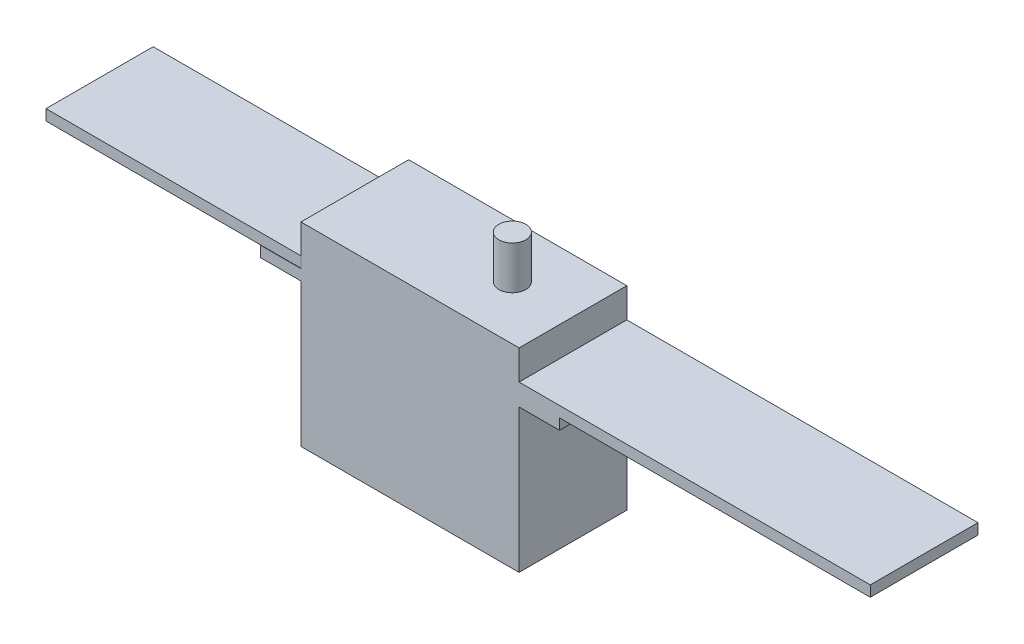
ISO-10303-21;
HEADER;
FILE_DESCRIPTION(('STEP AP214'),'2;1');
FILE_NAME('part.step','',(''),(''),'','','');
FILE_SCHEMA(('AUTOMOTIVE_DESIGN { 1 0 10303 214 1 1 1 1 }'));
ENDSEC;
DATA;
#1=APPLICATION_CONTEXT('core data for automotive mechanical design processes');
#2=APPLICATION_PROTOCOL_DEFINITION('international standard','automotive_design',2000,#1);
#3=PRODUCT_CONTEXT('',#1,'mechanical');
#4=PRODUCT('Part','Part','',(#3));
#5=PRODUCT_RELATED_PRODUCT_CATEGORY('part','',(#4));
#6=PRODUCT_DEFINITION_FORMATION('','',#4);
#7=PRODUCT_DEFINITION_CONTEXT('part definition',#1,'design');
#8=PRODUCT_DEFINITION('design','',#6,#7);
#9=PRODUCT_DEFINITION_SHAPE('','',#8);
#10=(LENGTH_UNIT() NAMED_UNIT(*) SI_UNIT(.MILLI.,.METRE.));
#11=(NAMED_UNIT(*) PLANE_ANGLE_UNIT() SI_UNIT($,.RADIAN.));
#12=(NAMED_UNIT(*) SI_UNIT($,.STERADIAN.) SOLID_ANGLE_UNIT());
#13=UNCERTAINTY_MEASURE_WITH_UNIT(LENGTH_MEASURE(1.E-05),#10,'distance_accuracy_value','');
#14=(GEOMETRIC_REPRESENTATION_CONTEXT(3) GLOBAL_UNCERTAINTY_ASSIGNED_CONTEXT((#13)) GLOBAL_UNIT_ASSIGNED_CONTEXT((#10,
#11,#12)) REPRESENTATION_CONTEXT('',''));
#15=CARTESIAN_POINT('',(0.,0.,0.));
#16=DIRECTION('',(0.,0.,1.));
#17=DIRECTION('',(1.,0.,0.));
#18=AXIS2_PLACEMENT_3D('',#15,#16,#17);
#19=CARTESIAN_POINT('',(23.7567379919232,36.1,-10.7539016762014));
#20=DIRECTION('',(-1.,0.,0.));
#21=DIRECTION('',(0.,0.,1.));
#22=AXIS2_PLACEMENT_3D('',#19,#20,#21);
#23=PLANE('',#22);
#24=DIRECTION('',(0.,-1.,0.));
#25=VECTOR('',#24,1.);
#26=CARTESIAN_POINT('',(23.7567379919232,30.6,-10.7535493471715));
#27=LINE('',#26,#25);
#28=CARTESIAN_POINT('',(23.7567379919232,30.6,-10.7535493471715));
#29=VERTEX_POINT('',#28);
#30=CARTESIAN_POINT('',(23.7567379919232,28.6,-10.7535493471715));
#31=VERTEX_POINT('',#30);
#32=EDGE_CURVE('E717',#29,#31,#27,.T.);
#33=ORIENTED_EDGE('',*,*,#32,.T.);
#34=DIRECTION('',(0.,0.,-1.));
#35=VECTOR('',#34,1.);
#36=CARTESIAN_POINT('',(23.7567379919232,28.6,-10.7539016762014));
#37=LINE('',#36,#35);
#38=CARTESIAN_POINT('',(23.7567379919232,28.6,-10.7539016762015));
#39=VERTEX_POINT('',#38);
#40=EDGE_CURVE('E264',#31,#39,#37,.T.);
#41=ORIENTED_EDGE('',*,*,#40,.T.);
#42=DIRECTION('',(0.,-1.,0.));
#43=VECTOR('',#42,1.);
#44=CARTESIAN_POINT('',(23.7567379919232,36.1,-10.7539016762014));
#45=LINE('',#44,#43);
#46=CARTESIAN_POINT('',(23.7567379919232,36.1,-10.7539016762014));
#47=VERTEX_POINT('',#46);
#48=EDGE_CURVE('E203',#47,#39,#45,.T.);
#49=ORIENTED_EDGE('',*,*,#48,.F.);
#50=DIRECTION('',(0.,0.,-1.));
#51=VECTOR('',#50,1.);
#52=CARTESIAN_POINT('',(23.7567379919232,36.1,-10.7539016762014));
#53=LINE('',#52,#51);
#54=CARTESIAN_POINT('',(23.7567379919232,36.1,9.24609832379855));
#55=VERTEX_POINT('',#54);
#56=EDGE_CURVE('E200',#55,#47,#53,.T.);
#57=ORIENTED_EDGE('',*,*,#56,.F.);
#58=DIRECTION('',(0.,-1.,0.));
#59=VECTOR('',#58,1.);
#60=CARTESIAN_POINT('',(23.7567379919232,36.1,9.24609832379855));
#61=LINE('',#60,#59);
#62=CARTESIAN_POINT('',(23.7567379919232,30.6,9.24609832379855));
#63=VERTEX_POINT('',#62);
#64=EDGE_CURVE('E182',#55,#63,#61,.T.);
#65=ORIENTED_EDGE('',*,*,#64,.T.);
#66=DIRECTION('',(0.,0.,1.));
#67=VECTOR('',#66,1.);
#68=CARTESIAN_POINT('',(23.7567379919232,30.6,9.24609832379855));
#69=LINE('',#68,#67);
#70=EDGE_CURVE('E189',#29,#63,#69,.T.);
#71=ORIENTED_EDGE('',*,*,#70,.F.);
#72=EDGE_LOOP('',(#33,#41,#49,#57,#65,#71));
#73=FACE_BOUND('',#72,.T.);
#74=ADVANCED_FACE('F34',(#73),#23,.F.);
#75=CARTESIAN_POINT('',(31.2567379919232,28.6,-10.7539016762015));
#76=DIRECTION('',(0.,1.,0.));
#77=DIRECTION('',(0.,0.,1.));
#78=AXIS2_PLACEMENT_3D('',#75,#76,#77);
#79=PLANE('',#78);
#80=ORIENTED_EDGE('',*,*,#40,.F.);
#81=DIRECTION('',(-1.,0.,0.));
#82=VECTOR('',#81,1.);
#83=CARTESIAN_POINT('',(23.7567379919232,28.6,-10.7535493471715));
#84=LINE('',#83,#82);
#85=CARTESIAN_POINT('',(31.2567379919232,28.6,-10.7535493471715));
#86=VERTEX_POINT('',#85);
#87=EDGE_CURVE('E720',#86,#31,#84,.T.);
#88=ORIENTED_EDGE('',*,*,#87,.F.);
#89=DIRECTION('',(0.,0.,-1.));
#90=VECTOR('',#89,1.);
#91=CARTESIAN_POINT('',(31.2567379919232,28.6,-10.7539016762015));
#92=LINE('',#91,#90);
#93=CARTESIAN_POINT('',(31.2567379919232,28.6,-10.7539016762015));
#94=VERTEX_POINT('',#93);
#95=EDGE_CURVE('E242',#86,#94,#92,.T.);
#96=ORIENTED_EDGE('',*,*,#95,.T.);
#97=DIRECTION('',(-1.,0.,0.));
#98=VECTOR('',#97,1.);
#99=CARTESIAN_POINT('',(31.2567379919232,28.6,-10.7539016762015));
#100=LINE('',#99,#98);
#101=EDGE_CURVE('E246',#94,#39,#100,.T.);
#102=ORIENTED_EDGE('',*,*,#101,.T.);
#103=EDGE_LOOP('',(#80,#88,#96,#102));
#104=FACE_BOUND('',#103,.T.);
#105=ADVANCED_FACE('F376',(#104),#79,.T.);
#106=CARTESIAN_POINT('',(-16.7432620080768,36.1,-10.7539016762014));
#107=DIRECTION('',(1.,0.,0.));
#108=DIRECTION('',(0.,0.,-1.));
#109=AXIS2_PLACEMENT_3D('',#106,#107,#108);
#110=PLANE('',#109);
#111=DIRECTION('',(0.,-1.,0.));
#112=VECTOR('',#111,1.);
#113=CARTESIAN_POINT('',(-16.7432620080768,30.6,-10.7106947176288));
#114=LINE('',#113,#112);
#115=CARTESIAN_POINT('',(-16.7432620080768,30.6,-10.7106947176288));
#116=VERTEX_POINT('',#115);
#117=CARTESIAN_POINT('',(-16.7432620080768,28.6,-10.7106947176288));
#118=VERTEX_POINT('',#117);
#119=EDGE_CURVE('E333',#116,#118,#114,.T.);
#120=ORIENTED_EDGE('',*,*,#119,.F.);
#121=DIRECTION('',(0.,0.,-1.));
#122=VECTOR('',#121,1.);
#123=CARTESIAN_POINT('',(-16.7432620080768,30.6,9.18935359710815));
#124=LINE('',#123,#122);
#125=CARTESIAN_POINT('',(-16.7432620080768,30.6,9.18935359710815));
#126=VERTEX_POINT('',#125);
#127=EDGE_CURVE('E336',#126,#116,#124,.T.);
#128=ORIENTED_EDGE('',*,*,#127,.F.);
#129=DIRECTION('',(0.,-1.,0.));
#130=VECTOR('',#129,1.);
#131=CARTESIAN_POINT('',(-16.7432620080768,30.6,9.18935359710815));
#132=LINE('',#131,#130);
#133=CARTESIAN_POINT('',(-16.7432620080768,28.6,9.18935359710815));
#134=VERTEX_POINT('',#133);
#135=EDGE_CURVE('E691',#126,#134,#132,.T.);
#136=ORIENTED_EDGE('',*,*,#135,.T.);
#137=DIRECTION('',(0.,0.,1.));
#138=VECTOR('',#137,1.);
#139=CARTESIAN_POINT('',(-16.7432620080768,28.6,-10.7539016762014));
#140=LINE('',#139,#138);
#141=CARTESIAN_POINT('',(-16.7432620080768,28.6,9.24609832379855));
#142=VERTEX_POINT('',#141);
#143=EDGE_CURVE('E266',#134,#142,#140,.T.);
#144=ORIENTED_EDGE('',*,*,#143,.T.);
#145=DIRECTION('',(0.,-1.,0.));
#146=VECTOR('',#145,1.);
#147=CARTESIAN_POINT('',(-16.7432620080768,36.1,9.24609832379855));
#148=LINE('',#147,#146);
#149=CARTESIAN_POINT('',(-16.7432620080768,36.1,9.24609832379855));
#150=VERTEX_POINT('',#149);
#151=EDGE_CURVE('E11',#150,#142,#148,.T.);
#152=ORIENTED_EDGE('',*,*,#151,.F.);
#153=DIRECTION('',(0.,0.,1.));
#154=VECTOR('',#153,1.);
#155=CARTESIAN_POINT('',(-16.7432620080768,36.1,-10.7539016762014));
#156=LINE('',#155,#154);
#157=CARTESIAN_POINT('',(-16.7432620080768,36.1,-10.7539016762014));
#158=VERTEX_POINT('',#157);
#159=EDGE_CURVE('E277',#158,#150,#156,.T.);
#160=ORIENTED_EDGE('',*,*,#159,.F.);
#161=DIRECTION('',(0.,-1.,0.));
#162=VECTOR('',#161,1.);
#163=CARTESIAN_POINT('',(-16.7432620080768,36.1,-10.7539016762014));
#164=LINE('',#163,#162);
#165=CARTESIAN_POINT('',(-16.7432620080768,28.6,-10.7539016762014));
#166=VERTEX_POINT('',#165);
#167=EDGE_CURVE('E296',#158,#166,#164,.T.);
#168=ORIENTED_EDGE('',*,*,#167,.T.);
#169=EDGE_CURVE('E267',#166,#118,#140,.T.);
#170=ORIENTED_EDGE('',*,*,#169,.T.);
#171=EDGE_LOOP('',(#120,#128,#136,#144,#152,#160,#168,#170));
#172=FACE_BOUND('',#171,.T.);
#173=ADVANCED_FACE('F331',(#172),#110,.F.);
#174=DIRECTION('',(0.,0.,-1.));
#175=VECTOR('',#174,1.);
#176=CARTESIAN_POINT('',(-24.2432620080768,28.6,-10.7539016762014));
#177=LINE('',#176,#175);
#178=CARTESIAN_POINT('',(-24.2432620080768,28.6,-10.7106947176288));
#179=VERTEX_POINT('',#178);
#180=CARTESIAN_POINT('',(-24.2432620080768,28.6,-10.7539016762014));
#181=VERTEX_POINT('',#180);
#182=EDGE_CURVE('E229',#179,#181,#177,.T.);
#183=ORIENTED_EDGE('',*,*,#182,.F.);
#184=DIRECTION('',(-1.,0.,0.));
#185=VECTOR('',#184,1.);
#186=CARTESIAN_POINT('',(-16.7432620080768,28.6,-10.7106947176288));
#187=LINE('',#186,#185);
#188=EDGE_CURVE('E59',#118,#179,#187,.T.);
#189=ORIENTED_EDGE('',*,*,#188,.F.);
#190=ORIENTED_EDGE('',*,*,#169,.F.);
#191=EDGE_CURVE('E250',#166,#181,#100,.T.);
#192=ORIENTED_EDGE('',*,*,#191,.T.);
#193=EDGE_LOOP('',(#183,#189,#190,#192));
#194=FACE_BOUND('',#193,.T.);
#195=ADVANCED_FACE('F329',(#194),#79,.T.);
#196=ORIENTED_EDGE('',*,*,#143,.F.);
#197=DIRECTION('',(1.,0.,0.));
#198=VECTOR('',#197,1.);
#199=CARTESIAN_POINT('',(-16.7432620080768,28.6,9.18935359710815));
#200=LINE('',#199,#198);
#201=CARTESIAN_POINT('',(-24.2432620080768,28.6,9.18935359710815));
#202=VERTEX_POINT('',#201);
#203=EDGE_CURVE('E682',#202,#134,#200,.T.);
#204=ORIENTED_EDGE('',*,*,#203,.F.);
#205=CARTESIAN_POINT('',(-24.2432620080768,28.6,9.24609832379856));
#206=VERTEX_POINT('',#205);
#207=EDGE_CURVE('E230',#206,#202,#177,.T.);
#208=ORIENTED_EDGE('',*,*,#207,.F.);
#209=DIRECTION('',(-1.,0.,0.));
#210=VECTOR('',#209,1.);
#211=CARTESIAN_POINT('',(31.2567379919232,28.6,9.24609832379855));
#212=LINE('',#211,#210);
#213=EDGE_CURVE('E251',#142,#206,#212,.T.);
#214=ORIENTED_EDGE('',*,*,#213,.F.);
#215=EDGE_LOOP('',(#196,#204,#208,#214));
#216=FACE_BOUND('',#215,.T.);
#217=ADVANCED_FACE('F382',(#216),#79,.T.);
#218=CARTESIAN_POINT('',(-16.7432620080768,26.6,9.24609832379855));
#219=VERTEX_POINT('',#218);
#220=CARTESIAN_POINT('',(-16.7432620080768,0.,9.24609832379855));
#221=VERTEX_POINT('',#220);
#222=EDGE_CURVE('E43',#219,#221,#148,.T.);
#223=ORIENTED_EDGE('',*,*,#222,.F.);
#224=DIRECTION('',(0.,0.,-1.));
#225=VECTOR('',#224,1.);
#226=CARTESIAN_POINT('',(-16.7432620080768,26.6,-10.7539016762014));
#227=LINE('',#226,#225);
#228=CARTESIAN_POINT('',(-16.7432620080768,26.6,-10.7539016762014));
#229=VERTEX_POINT('',#228);
#230=EDGE_CURVE('E261',#219,#229,#227,.T.);
#231=ORIENTED_EDGE('',*,*,#230,.T.);
#232=CARTESIAN_POINT('',(-16.7432620080768,0.,-10.7539016762014));
#233=VERTEX_POINT('',#232);
#234=EDGE_CURVE('E286',#229,#233,#164,.T.);
#235=ORIENTED_EDGE('',*,*,#234,.T.);
#236=DIRECTION('',(0.,0.,1.));
#237=VECTOR('',#236,1.);
#238=CARTESIAN_POINT('',(-16.7432620080768,0.,-10.7539016762014));
#239=LINE('',#238,#237);
#240=EDGE_CURVE('E274',#233,#221,#239,.T.);
#241=ORIENTED_EDGE('',*,*,#240,.T.);
#242=EDGE_LOOP('',(#223,#231,#235,#241));
#243=FACE_BOUND('',#242,.T.);
#244=ADVANCED_FACE('F36',(#243),#110,.F.);
#245=CARTESIAN_POINT('',(-16.7432620080768,36.1,9.24609832379855));
#246=DIRECTION('',(0.,0.,-1.));
#247=DIRECTION('',(-1.,0.,0.));
#248=AXIS2_PLACEMENT_3D('',#245,#246,#247);
#249=PLANE('',#248);
#250=CARTESIAN_POINT('',(23.7567379919232,26.6,9.24609832379855));
#251=VERTEX_POINT('',#250);
#252=CARTESIAN_POINT('',(23.7567379919232,0.,9.24609832379855));
#253=VERTEX_POINT('',#252);
#254=EDGE_CURVE('E201',#251,#253,#61,.T.);
#255=ORIENTED_EDGE('',*,*,#254,.F.);
#256=DIRECTION('',(-1.,0.,0.));
#257=VECTOR('',#256,1.);
#258=CARTESIAN_POINT('',(31.2567379919232,26.6,9.24609832379855));
#259=LINE('',#258,#257);
#260=CARTESIAN_POINT('',(31.2567379919232,26.6,9.24609832379855));
#261=VERTEX_POINT('',#260);
#262=EDGE_CURVE('E253',#261,#251,#259,.T.);
#263=ORIENTED_EDGE('',*,*,#262,.F.);
#264=DIRECTION('',(0.,1.,0.));
#265=VECTOR('',#264,1.);
#266=CARTESIAN_POINT('',(31.2567379919232,28.6,9.24609832379855));
#267=LINE('',#266,#265);
#268=CARTESIAN_POINT('',(31.2567379919232,28.6,9.24609832379855));
#269=VERTEX_POINT('',#268);
#270=EDGE_CURVE('E239',#261,#269,#267,.T.);
#271=ORIENTED_EDGE('',*,*,#270,.T.);
#272=DIRECTION('',(1.,0.,0.));
#273=VECTOR('',#272,1.);
#274=CARTESIAN_POINT('',(23.7567379919232,28.6,9.24609832379855));
#275=LINE('',#274,#273);
#276=CARTESIAN_POINT('',(88.9534286681908,28.6,9.24609832379855));
#277=VERTEX_POINT('',#276);
#278=EDGE_CURVE('E723',#269,#277,#275,.T.);
#279=ORIENTED_EDGE('',*,*,#278,.T.);
#280=DIRECTION('',(0.,-1.,0.));
#281=VECTOR('',#280,1.);
#282=CARTESIAN_POINT('',(88.9534286681908,30.6,9.24609832379855));
#283=LINE('',#282,#281);
#284=CARTESIAN_POINT('',(88.9534286681908,30.6,9.24609832379855));
#285=VERTEX_POINT('',#284);
#286=EDGE_CURVE('E185',#285,#277,#283,.T.);
#287=ORIENTED_EDGE('',*,*,#286,.F.);
#288=DIRECTION('',(1.,0.,0.));
#289=VECTOR('',#288,1.);
#290=CARTESIAN_POINT('',(23.7567379919232,30.6,9.24609832379855));
#291=LINE('',#290,#289);
#292=EDGE_CURVE('E177',#63,#285,#291,.T.);
#293=ORIENTED_EDGE('',*,*,#292,.F.);
#294=ORIENTED_EDGE('',*,*,#64,.F.);
#295=DIRECTION('',(1.,0.,0.));
#296=VECTOR('',#295,1.);
#297=CARTESIAN_POINT('',(-16.7432620080768,36.1,9.24609832379855));
#298=LINE('',#297,#296);
#299=EDGE_CURVE('E280',#150,#55,#298,.T.);
#300=ORIENTED_EDGE('',*,*,#299,.F.);
#301=ORIENTED_EDGE('',*,*,#151,.T.);
#302=ORIENTED_EDGE('',*,*,#213,.T.);
#303=DIRECTION('',(0.,1.,0.));
#304=VECTOR('',#303,1.);
#305=CARTESIAN_POINT('',(-24.2432620080768,28.6,9.24609832379856));
#306=LINE('',#305,#304);
#307=CARTESIAN_POINT('',(-24.2432620080768,26.6,9.24609832379856));
#308=VERTEX_POINT('',#307);
#309=EDGE_CURVE('E226',#308,#206,#306,.T.);
#310=ORIENTED_EDGE('',*,*,#309,.F.);
#311=EDGE_CURVE('E255',#219,#308,#259,.T.);
#312=ORIENTED_EDGE('',*,*,#311,.F.);
#313=ORIENTED_EDGE('',*,*,#222,.T.);
#314=DIRECTION('',(1.,0.,0.));
#315=VECTOR('',#314,1.);
#316=CARTESIAN_POINT('',(-16.7432620080768,0.,9.24609832379855));
#317=LINE('',#316,#315);
#318=EDGE_CURVE('E289',#221,#253,#317,.T.);
#319=ORIENTED_EDGE('',*,*,#318,.T.);
#320=EDGE_LOOP('',(#255,#263,#271,#279,#287,#293,#294,#300,#301,#302,#310,#312,#313,#319));
#321=FACE_BOUND('',#320,.T.);
#322=ADVANCED_FACE('F180',(#321),#249,.F.);
#323=CARTESIAN_POINT('',(23.7567379919232,26.6,-10.7539016762015));
#324=VERTEX_POINT('',#323);
#325=CARTESIAN_POINT('',(23.7567379919232,0.,-10.7539016762014));
#326=VERTEX_POINT('',#325);
#327=EDGE_CURVE('E298',#324,#326,#45,.T.);
#328=ORIENTED_EDGE('',*,*,#327,.F.);
#329=DIRECTION('',(0.,0.,1.));
#330=VECTOR('',#329,1.);
#331=CARTESIAN_POINT('',(23.7567379919232,26.6,-10.7539016762014));
#332=LINE('',#331,#330);
#333=EDGE_CURVE('E249',#324,#251,#332,.T.);
#334=ORIENTED_EDGE('',*,*,#333,.T.);
#335=ORIENTED_EDGE('',*,*,#254,.T.);
#336=DIRECTION('',(0.,0.,-1.));
#337=VECTOR('',#336,1.);
#338=CARTESIAN_POINT('',(23.7567379919232,0.,-10.7539016762014));
#339=LINE('',#338,#337);
#340=EDGE_CURVE('E292',#253,#326,#339,.T.);
#341=ORIENTED_EDGE('',*,*,#340,.T.);
#342=EDGE_LOOP('',(#328,#334,#335,#341));
#343=FACE_BOUND('',#342,.T.);
#344=ADVANCED_FACE('F366',(#343),#23,.F.);
#345=CARTESIAN_POINT('',(-16.7432620080768,36.1,-10.7539016762014));
#346=DIRECTION('',(0.,0.,1.));
#347=DIRECTION('',(1.,0.,0.));
#348=AXIS2_PLACEMENT_3D('',#345,#346,#347);
#349=PLANE('',#348);
#350=ORIENTED_EDGE('',*,*,#234,.F.);
#351=DIRECTION('',(-1.,0.,0.));
#352=VECTOR('',#351,1.);
#353=CARTESIAN_POINT('',(31.2567379919232,26.6,-10.7539016762015));
#354=LINE('',#353,#352);
#355=CARTESIAN_POINT('',(-24.2432620080768,26.6,-10.7539016762014));
#356=VERTEX_POINT('',#355);
#357=EDGE_CURVE('E245',#229,#356,#354,.T.);
#358=ORIENTED_EDGE('',*,*,#357,.T.);
#359=DIRECTION('',(0.,-1.,0.));
#360=VECTOR('',#359,1.);
#361=CARTESIAN_POINT('',(-24.2432620080768,28.6,-10.7539016762014));
#362=LINE('',#361,#360);
#363=EDGE_CURVE('E208',#181,#356,#362,.T.);
#364=ORIENTED_EDGE('',*,*,#363,.F.);
#365=ORIENTED_EDGE('',*,*,#191,.F.);
#366=ORIENTED_EDGE('',*,*,#167,.F.);
#367=DIRECTION('',(-1.,0.,0.));
#368=VECTOR('',#367,1.);
#369=CARTESIAN_POINT('',(-16.7432620080768,36.1,-10.7539016762014));
#370=LINE('',#369,#368);
#371=EDGE_CURVE('E284',#47,#158,#370,.T.);
#372=ORIENTED_EDGE('',*,*,#371,.F.);
#373=ORIENTED_EDGE('',*,*,#48,.T.);
#374=ORIENTED_EDGE('',*,*,#101,.F.);
#375=DIRECTION('',(0.,-1.,0.));
#376=VECTOR('',#375,1.);
#377=CARTESIAN_POINT('',(31.2567379919232,28.6,-10.7539016762015));
#378=LINE('',#377,#376);
#379=CARTESIAN_POINT('',(31.2567379919232,26.6,-10.7539016762015));
#380=VERTEX_POINT('',#379);
#381=EDGE_CURVE('E233',#94,#380,#378,.T.);
#382=ORIENTED_EDGE('',*,*,#381,.T.);
#383=EDGE_CURVE('E256',#380,#324,#354,.T.);
#384=ORIENTED_EDGE('',*,*,#383,.T.);
#385=ORIENTED_EDGE('',*,*,#327,.T.);
#386=DIRECTION('',(-1.,0.,0.));
#387=VECTOR('',#386,1.);
#388=CARTESIAN_POINT('',(-16.7432620080768,0.,-10.7539016762014));
#389=LINE('',#388,#387);
#390=EDGE_CURVE('E281',#326,#233,#389,.T.);
#391=ORIENTED_EDGE('',*,*,#390,.T.);
#392=EDGE_LOOP('',(#350,#358,#364,#365,#366,#372,#373,#374,#382,#384,#385,#391));
#393=FACE_BOUND('',#392,.T.);
#394=ADVANCED_FACE('F308',(#393),#349,.F.);
#395=CARTESIAN_POINT('',(0.,36.1,0.));
#396=DIRECTION('',(0.,1.,0.));
#397=DIRECTION('',(0.,0.,1.));
#398=AXIS2_PLACEMENT_3D('',#395,#396,#397);
#399=PLANE('',#398);
#400=CARTESIAN_POINT('',(12.5067379919232,36.1,-0.753901676201447));
#401=DIRECTION('',(0.,1.,0.));
#402=DIRECTION('',(0.,0.,1.));
#403=AXIS2_PLACEMENT_3D('',#400,#401,#402);
#404=CIRCLE('',#403,2.5);
#405=CARTESIAN_POINT('',(12.5067379919232,36.1,1.74609832379855));
#406=VERTEX_POINT('',#405);
#407=EDGE_CURVE('E270',#406,#406,#404,.T.);
#408=ORIENTED_EDGE('',*,*,#407,.F.);
#409=EDGE_LOOP('',(#408));
#410=FACE_BOUND('',#409,.T.);
#411=ORIENTED_EDGE('',*,*,#159,.T.);
#412=ORIENTED_EDGE('',*,*,#299,.T.);
#413=ORIENTED_EDGE('',*,*,#56,.T.);
#414=ORIENTED_EDGE('',*,*,#371,.T.);
#415=EDGE_LOOP('',(#411,#412,#413,#414));
#416=FACE_BOUND('',#415,.T.);
#417=ADVANCED_FACE('F373',(#410,#416),#399,.T.);
#418=CARTESIAN_POINT('',(0.,0.,0.));
#419=DIRECTION('',(0.,1.,0.));
#420=DIRECTION('',(0.,0.,1.));
#421=AXIS2_PLACEMENT_3D('',#418,#419,#420);
#422=PLANE('',#421);
#423=ORIENTED_EDGE('',*,*,#240,.F.);
#424=ORIENTED_EDGE('',*,*,#390,.F.);
#425=ORIENTED_EDGE('',*,*,#340,.F.);
#426=ORIENTED_EDGE('',*,*,#318,.F.);
#427=EDGE_LOOP('',(#423,#424,#425,#426));
#428=FACE_BOUND('',#427,.T.);
#429=ADVANCED_FACE('F313',(#428),#422,.F.);
#430=CARTESIAN_POINT('',(12.5067379919232,44.1,-0.753901676201447));
#431=DIRECTION('',(0.,-1.,0.));
#432=DIRECTION('',(0.,0.,-1.));
#433=AXIS2_PLACEMENT_3D('',#430,#431,#432);
#434=CYLINDRICAL_SURFACE('',#433,2.5);
#435=CARTESIAN_POINT('',(12.5067379919232,44.1,-0.753901676201447));
#436=DIRECTION('',(0.,1.,0.));
#437=DIRECTION('',(0.,0.,1.));
#438=AXIS2_PLACEMENT_3D('',#435,#436,#437);
#439=CIRCLE('',#438,2.5);
#440=CARTESIAN_POINT('',(12.5067379919232,44.1,1.74609832379855));
#441=VERTEX_POINT('',#440);
#442=EDGE_CURVE('E271',#441,#441,#439,.T.);
#443=ORIENTED_EDGE('',*,*,#442,.F.);
#444=EDGE_LOOP('',(#443));
#445=FACE_BOUND('',#444,.T.);
#446=ORIENTED_EDGE('',*,*,#407,.T.);
#447=EDGE_LOOP('',(#446));
#448=FACE_BOUND('',#447,.T.);
#449=ADVANCED_FACE('F653',(#445,#448),#434,.T.);
#450=CARTESIAN_POINT('',(12.5067379919232,44.1,-0.753901676201447));
#451=DIRECTION('',(0.,1.,0.));
#452=DIRECTION('',(0.,0.,1.));
#453=AXIS2_PLACEMENT_3D('',#450,#451,#452);
#454=PLANE('',#453);
#455=ORIENTED_EDGE('',*,*,#442,.T.);
#456=EDGE_LOOP('',(#455));
#457=FACE_BOUND('',#456,.T.);
#458=ADVANCED_FACE('F421',(#457),#454,.T.);
#459=CARTESIAN_POINT('',(31.2567379919232,0.,0.));
#460=DIRECTION('',(-1.,0.,0.));
#461=DIRECTION('',(0.,0.,1.));
#462=AXIS2_PLACEMENT_3D('',#459,#460,#461);
#463=PLANE('',#462);
#464=ORIENTED_EDGE('',*,*,#381,.F.);
#465=ORIENTED_EDGE('',*,*,#95,.F.);
#466=EDGE_CURVE('E243',#269,#86,#92,.T.);
#467=ORIENTED_EDGE('',*,*,#466,.F.);
#468=ORIENTED_EDGE('',*,*,#270,.F.);
#469=DIRECTION('',(0.,0.,1.));
#470=VECTOR('',#469,1.);
#471=CARTESIAN_POINT('',(31.2567379919232,26.6,-10.7539016762015));
#472=LINE('',#471,#470);
#473=EDGE_CURVE('E236',#380,#261,#472,.T.);
#474=ORIENTED_EDGE('',*,*,#473,.F.);
#475=EDGE_LOOP('',(#464,#465,#467,#468,#474));
#476=FACE_BOUND('',#475,.T.);
#477=ADVANCED_FACE('F359',(#476),#463,.F.);
#478=CARTESIAN_POINT('',(31.2567379919232,26.6,-10.7539016762015));
#479=DIRECTION('',(0.,-1.,0.));
#480=DIRECTION('',(0.,0.,-1.));
#481=AXIS2_PLACEMENT_3D('',#478,#479,#480);
#482=PLANE('',#481);
#483=CARTESIAN_POINT('',(27.5067379919232,26.6,4.24609832379854));
#484=DIRECTION('',(0.,-1.,0.));
#485=DIRECTION('',(0.,0.,-1.));
#486=AXIS2_PLACEMENT_3D('',#483,#484,#485);
#487=CIRCLE('',#486,2.);
#488=CARTESIAN_POINT('',(27.5067379919232,26.6,2.24609832379854));
#489=VERTEX_POINT('',#488);
#490=EDGE_CURVE('E220',#489,#489,#487,.T.);
#491=ORIENTED_EDGE('',*,*,#490,.F.);
#492=EDGE_LOOP('',(#491));
#493=FACE_BOUND('',#492,.T.);
#494=CARTESIAN_POINT('',(27.5067379919232,26.6,-5.75390167620146));
#495=DIRECTION('',(0.,-1.,0.));
#496=DIRECTION('',(0.,0.,-1.));
#497=AXIS2_PLACEMENT_3D('',#494,#495,#496);
#498=CIRCLE('',#497,2.);
#499=CARTESIAN_POINT('',(27.5067379919232,26.6,-7.75390167620146));
#500=VERTEX_POINT('',#499);
#501=EDGE_CURVE('E209',#500,#500,#498,.T.);
#502=ORIENTED_EDGE('',*,*,#501,.F.);
#503=EDGE_LOOP('',(#502));
#504=FACE_BOUND('',#503,.T.);
#505=ORIENTED_EDGE('',*,*,#333,.F.);
#506=ORIENTED_EDGE('',*,*,#383,.F.);
#507=ORIENTED_EDGE('',*,*,#473,.T.);
#508=ORIENTED_EDGE('',*,*,#262,.T.);
#509=EDGE_LOOP('',(#505,#506,#507,#508));
#510=FACE_BOUND('',#509,.T.);
#511=ADVANCED_FACE('F356',(#493,#504,#510),#482,.T.);
#512=CARTESIAN_POINT('',(-20.4932620080768,26.6,4.24609832379855));
#513=DIRECTION('',(0.,-1.,0.));
#514=DIRECTION('',(0.,0.,-1.));
#515=AXIS2_PLACEMENT_3D('',#512,#513,#514);
#516=CIRCLE('',#515,2.);
#517=CARTESIAN_POINT('',(-20.4932620080768,26.6,2.24609832379855));
#518=VERTEX_POINT('',#517);
#519=EDGE_CURVE('E38',#518,#518,#516,.T.);
#520=ORIENTED_EDGE('',*,*,#519,.F.);
#521=EDGE_LOOP('',(#520));
#522=FACE_BOUND('',#521,.T.);
#523=CARTESIAN_POINT('',(-20.4932620080768,26.6,-5.75390167620145));
#524=DIRECTION('',(0.,-1.,0.));
#525=DIRECTION('',(0.,0.,-1.));
#526=AXIS2_PLACEMENT_3D('',#523,#524,#525);
#527=CIRCLE('',#526,2.);
#528=CARTESIAN_POINT('',(-20.4932620080768,26.6,-7.75390167620145));
#529=VERTEX_POINT('',#528);
#530=EDGE_CURVE('E206',#529,#529,#527,.T.);
#531=ORIENTED_EDGE('',*,*,#530,.F.);
#532=EDGE_LOOP('',(#531));
#533=FACE_BOUND('',#532,.T.);
#534=ORIENTED_EDGE('',*,*,#230,.F.);
#535=ORIENTED_EDGE('',*,*,#311,.T.);
#536=DIRECTION('',(0.,0.,1.));
#537=VECTOR('',#536,1.);
#538=CARTESIAN_POINT('',(-24.2432620080768,26.6,-10.7539016762014));
#539=LINE('',#538,#537);
#540=EDGE_CURVE('E213',#356,#308,#539,.T.);
#541=ORIENTED_EDGE('',*,*,#540,.F.);
#542=ORIENTED_EDGE('',*,*,#357,.F.);
#543=EDGE_LOOP('',(#534,#535,#541,#542));
#544=FACE_BOUND('',#543,.T.);
#545=ADVANCED_FACE('F318',(#522,#533,#544),#482,.T.);
#546=CARTESIAN_POINT('',(-24.2432620080768,0.,0.));
#547=DIRECTION('',(-1.,0.,0.));
#548=DIRECTION('',(0.,0.,1.));
#549=AXIS2_PLACEMENT_3D('',#546,#547,#548);
#550=PLANE('',#549);
#551=ORIENTED_EDGE('',*,*,#363,.T.);
#552=ORIENTED_EDGE('',*,*,#540,.T.);
#553=ORIENTED_EDGE('',*,*,#309,.T.);
#554=ORIENTED_EDGE('',*,*,#207,.T.);
#555=DIRECTION('',(0.,0.,-1.));
#556=VECTOR('',#555,1.);
#557=CARTESIAN_POINT('',(-24.2432620080768,28.6,0.));
#558=LINE('',#557,#556);
#559=EDGE_CURVE('E349',#202,#179,#558,.T.);
#560=ORIENTED_EDGE('',*,*,#559,.T.);
#561=ORIENTED_EDGE('',*,*,#182,.T.);
#562=EDGE_LOOP('',(#551,#552,#553,#554,#560,#561));
#563=FACE_BOUND('',#562,.T.);
#564=ADVANCED_FACE('F320',(#563),#550,.T.);
#565=CARTESIAN_POINT('',(-20.4932620080768,21.1,-5.75390167620145));
#566=DIRECTION('',(0.,1.,0.));
#567=DIRECTION('',(0.,0.,1.));
#568=AXIS2_PLACEMENT_3D('',#565,#566,#567);
#569=CYLINDRICAL_SURFACE('',#568,2.);
#570=ORIENTED_EDGE('',*,*,#530,.T.);
#571=EDGE_LOOP('',(#570));
#572=FACE_BOUND('',#571,.T.);
#573=CARTESIAN_POINT('',(-20.4932620080768,28.6,-5.75390167620145));
#574=DIRECTION('',(0.,1.,0.));
#575=DIRECTION('',(0.,0.,1.));
#576=AXIS2_PLACEMENT_3D('',#573,#574,#575);
#577=CIRCLE('',#576,2.);
#578=CARTESIAN_POINT('',(-20.4932620080768,28.6,-3.75390167620144));
#579=VERTEX_POINT('',#578);
#580=EDGE_CURVE('E341',#579,#579,#577,.F.);
#581=ORIENTED_EDGE('',*,*,#580,.F.);
#582=EDGE_LOOP('',(#581));
#583=FACE_BOUND('',#582,.T.);
#584=ADVANCED_FACE('F433',(#572,#583),#569,.F.);
#585=CARTESIAN_POINT('',(27.5067379919232,21.1,-5.75390167620146));
#586=DIRECTION('',(0.,1.,0.));
#587=DIRECTION('',(0.,0.,1.));
#588=AXIS2_PLACEMENT_3D('',#585,#586,#587);
#589=CYLINDRICAL_SURFACE('',#588,2.);
#590=ORIENTED_EDGE('',*,*,#501,.T.);
#591=EDGE_LOOP('',(#590));
#592=FACE_BOUND('',#591,.T.);
#593=CARTESIAN_POINT('',(27.5067379919232,28.6,-5.75390167620146));
#594=DIRECTION('',(0.,-1.,0.));
#595=DIRECTION('',(0.,0.,-1.));
#596=AXIS2_PLACEMENT_3D('',#593,#594,#595);
#597=CIRCLE('',#596,2.);
#598=CARTESIAN_POINT('',(27.5067379919232,28.6,-7.75390167620146));
#599=VERTEX_POINT('',#598);
#600=EDGE_CURVE('E701',#599,#599,#597,.F.);
#601=ORIENTED_EDGE('',*,*,#600,.T.);
#602=EDGE_LOOP('',(#601));
#603=FACE_BOUND('',#602,.T.);
#604=ADVANCED_FACE('F568',(#592,#603),#589,.F.);
#605=CARTESIAN_POINT('',(-20.4932620080768,21.1,4.24609832379855));
#606=DIRECTION('',(0.,1.,0.));
#607=DIRECTION('',(0.,0.,1.));
#608=AXIS2_PLACEMENT_3D('',#605,#606,#607);
#609=CYLINDRICAL_SURFACE('',#608,2.);
#610=ORIENTED_EDGE('',*,*,#519,.T.);
#611=EDGE_LOOP('',(#610));
#612=FACE_BOUND('',#611,.T.);
#613=CARTESIAN_POINT('',(-20.4932620080768,28.6,4.24609832379855));
#614=DIRECTION('',(0.,1.,0.));
#615=DIRECTION('',(0.,0.,1.));
#616=AXIS2_PLACEMENT_3D('',#613,#614,#615);
#617=CIRCLE('',#616,2.);
#618=CARTESIAN_POINT('',(-20.4932620080768,28.6,6.24609832379856));
#619=VERTEX_POINT('',#618);
#620=EDGE_CURVE('E337',#619,#619,#617,.F.);
#621=ORIENTED_EDGE('',*,*,#620,.F.);
#622=EDGE_LOOP('',(#621));
#623=FACE_BOUND('',#622,.T.);
#624=ADVANCED_FACE('F565',(#612,#623),#609,.F.);
#625=CARTESIAN_POINT('',(27.5067379919232,21.1,4.24609832379854));
#626=DIRECTION('',(0.,1.,0.));
#627=DIRECTION('',(0.,0.,1.));
#628=AXIS2_PLACEMENT_3D('',#625,#626,#627);
#629=CYLINDRICAL_SURFACE('',#628,2.);
#630=ORIENTED_EDGE('',*,*,#490,.T.);
#631=EDGE_LOOP('',(#630));
#632=FACE_BOUND('',#631,.T.);
#633=CARTESIAN_POINT('',(27.5067379919232,28.6,4.24609832379854));
#634=DIRECTION('',(0.,-1.,0.));
#635=DIRECTION('',(0.,0.,-1.));
#636=AXIS2_PLACEMENT_3D('',#633,#634,#635);
#637=CIRCLE('',#636,2.);
#638=CARTESIAN_POINT('',(27.5067379919232,28.6,2.24609832379854));
#639=VERTEX_POINT('',#638);
#640=EDGE_CURVE('E703',#639,#639,#637,.F.);
#641=ORIENTED_EDGE('',*,*,#640,.T.);
#642=EDGE_LOOP('',(#641));
#643=FACE_BOUND('',#642,.T.);
#644=ADVANCED_FACE('F353',(#632,#643),#629,.F.);
#645=CARTESIAN_POINT('',(0.,28.6,0.));
#646=DIRECTION('',(0.,1.,0.));
#647=DIRECTION('',(0.,0.,1.));
#648=AXIS2_PLACEMENT_3D('',#645,#646,#647);
#649=PLANE('',#648);
#650=ORIENTED_EDGE('',*,*,#620,.T.);
#651=EDGE_LOOP('',(#650));
#652=FACE_BOUND('',#651,.T.);
#653=ADVANCED_FACE('F442',(#652),#649,.F.);
#654=ORIENTED_EDGE('',*,*,#580,.T.);
#655=EDGE_LOOP('',(#654));
#656=FACE_BOUND('',#655,.T.);
#657=ADVANCED_FACE('F446',(#656),#649,.F.);
#658=CARTESIAN_POINT('',(-16.7432620080768,30.6,-10.7106947176288));
#659=DIRECTION('',(0.,0.,1.));
#660=DIRECTION('',(1.,0.,0.));
#661=AXIS2_PLACEMENT_3D('',#658,#659,#660);
#662=PLANE('',#661);
#663=ORIENTED_EDGE('',*,*,#188,.T.);
#664=CARTESIAN_POINT('',(-64.1266485093488,28.6,-10.7106947176288));
#665=VERTEX_POINT('',#664);
#666=EDGE_CURVE('E699',#179,#665,#187,.T.);
#667=ORIENTED_EDGE('',*,*,#666,.T.);
#668=DIRECTION('',(0.,-1.,0.));
#669=VECTOR('',#668,1.);
#670=CARTESIAN_POINT('',(-64.1266485093488,30.6,-10.7106947176288));
#671=LINE('',#670,#669);
#672=CARTESIAN_POINT('',(-64.1266485093488,30.6,-10.7106947176288));
#673=VERTEX_POINT('',#672);
#674=EDGE_CURVE('E338',#673,#665,#671,.T.);
#675=ORIENTED_EDGE('',*,*,#674,.F.);
#676=DIRECTION('',(-1.,0.,0.));
#677=VECTOR('',#676,1.);
#678=CARTESIAN_POINT('',(-16.7432620080768,30.6,-10.7106947176288));
#679=LINE('',#678,#677);
#680=EDGE_CURVE('E709',#116,#673,#679,.T.);
#681=ORIENTED_EDGE('',*,*,#680,.F.);
#682=ORIENTED_EDGE('',*,*,#119,.T.);
#683=EDGE_LOOP('',(#663,#667,#675,#681,#682));
#684=FACE_BOUND('',#683,.T.);
#685=ADVANCED_FACE('F458',(#684),#662,.F.);
#686=CARTESIAN_POINT('',(-64.1266485093488,30.6,9.18935359710815));
#687=DIRECTION('',(1.,0.,0.));
#688=DIRECTION('',(0.,0.,-1.));
#689=AXIS2_PLACEMENT_3D('',#686,#687,#688);
#690=PLANE('',#689);
#691=DIRECTION('',(0.,0.,1.));
#692=VECTOR('',#691,1.);
#693=CARTESIAN_POINT('',(-64.1266485093488,28.6,9.18935359710815));
#694=LINE('',#693,#692);
#695=CARTESIAN_POINT('',(-64.1266485093488,28.6,9.18935359710815));
#696=VERTEX_POINT('',#695);
#697=EDGE_CURVE('E686',#665,#696,#694,.T.);
#698=ORIENTED_EDGE('',*,*,#697,.T.);
#699=DIRECTION('',(0.,-1.,0.));
#700=VECTOR('',#699,1.);
#701=CARTESIAN_POINT('',(-64.1266485093488,30.6,9.18935359710815));
#702=LINE('',#701,#700);
#703=CARTESIAN_POINT('',(-64.1266485093488,30.6,9.18935359710815));
#704=VERTEX_POINT('',#703);
#705=EDGE_CURVE('E344',#704,#696,#702,.T.);
#706=ORIENTED_EDGE('',*,*,#705,.F.);
#707=DIRECTION('',(0.,0.,1.));
#708=VECTOR('',#707,1.);
#709=CARTESIAN_POINT('',(-64.1266485093488,30.6,9.18935359710815));
#710=LINE('',#709,#708);
#711=EDGE_CURVE('E707',#673,#704,#710,.T.);
#712=ORIENTED_EDGE('',*,*,#711,.F.);
#713=ORIENTED_EDGE('',*,*,#674,.T.);
#714=EDGE_LOOP('',(#698,#706,#712,#713));
#715=FACE_BOUND('',#714,.T.);
#716=ADVANCED_FACE('F467',(#715),#690,.F.);
#717=CARTESIAN_POINT('',(-16.7432620080768,30.6,9.18935359710815));
#718=DIRECTION('',(0.,0.,-1.));
#719=DIRECTION('',(-1.,0.,0.));
#720=AXIS2_PLACEMENT_3D('',#717,#718,#719);
#721=PLANE('',#720);
#722=EDGE_CURVE('E685',#696,#202,#200,.T.);
#723=ORIENTED_EDGE('',*,*,#722,.T.);
#724=ORIENTED_EDGE('',*,*,#203,.T.);
#725=ORIENTED_EDGE('',*,*,#135,.F.);
#726=DIRECTION('',(1.,0.,0.));
#727=VECTOR('',#726,1.);
#728=CARTESIAN_POINT('',(-16.7432620080768,30.6,9.18935359710815));
#729=LINE('',#728,#727);
#730=EDGE_CURVE('E692',#704,#126,#729,.T.);
#731=ORIENTED_EDGE('',*,*,#730,.F.);
#732=ORIENTED_EDGE('',*,*,#705,.T.);
#733=EDGE_LOOP('',(#723,#724,#725,#731,#732));
#734=FACE_BOUND('',#733,.T.);
#735=ADVANCED_FACE('F476',(#734),#721,.F.);
#736=CARTESIAN_POINT('',(0.,30.6,0.));
#737=DIRECTION('',(0.,1.,0.));
#738=DIRECTION('',(0.,0.,1.));
#739=AXIS2_PLACEMENT_3D('',#736,#737,#738);
#740=PLANE('',#739);
#741=ORIENTED_EDGE('',*,*,#127,.T.);
#742=ORIENTED_EDGE('',*,*,#680,.T.);
#743=ORIENTED_EDGE('',*,*,#711,.T.);
#744=ORIENTED_EDGE('',*,*,#730,.T.);
#745=EDGE_LOOP('',(#741,#742,#743,#744));
#746=FACE_BOUND('',#745,.T.);
#747=ADVANCED_FACE('F486',(#746),#740,.T.);
#748=ORIENTED_EDGE('',*,*,#559,.F.);
#749=ORIENTED_EDGE('',*,*,#722,.F.);
#750=ORIENTED_EDGE('',*,*,#697,.F.);
#751=ORIENTED_EDGE('',*,*,#666,.F.);
#752=EDGE_LOOP('',(#748,#749,#750,#751));
#753=FACE_BOUND('',#752,.T.);
#754=ADVANCED_FACE('F449',(#753),#649,.F.);
#755=CARTESIAN_POINT('',(0.,28.6,0.));
#756=DIRECTION('',(0.,-1.,0.));
#757=DIRECTION('',(0.,0.,-1.));
#758=AXIS2_PLACEMENT_3D('',#755,#756,#757);
#759=PLANE('',#758);
#760=ORIENTED_EDGE('',*,*,#640,.F.);
#761=EDGE_LOOP('',(#760));
#762=FACE_BOUND('',#761,.T.);
#763=ADVANCED_FACE('F505',(#762),#759,.T.);
#764=ORIENTED_EDGE('',*,*,#600,.F.);
#765=EDGE_LOOP('',(#764));
#766=FACE_BOUND('',#765,.T.);
#767=ADVANCED_FACE('F514',(#766),#759,.T.);
#768=ORIENTED_EDGE('',*,*,#466,.T.);
#769=CARTESIAN_POINT('',(88.9534286681908,28.6,-10.7535493471715));
#770=VERTEX_POINT('',#769);
#771=EDGE_CURVE('E51',#770,#86,#84,.T.);
#772=ORIENTED_EDGE('',*,*,#771,.F.);
#773=DIRECTION('',(0.,0.,-1.));
#774=VECTOR('',#773,1.);
#775=CARTESIAN_POINT('',(88.9534286681908,28.6,9.24609832379855));
#776=LINE('',#775,#774);
#777=EDGE_CURVE('E721',#277,#770,#776,.T.);
#778=ORIENTED_EDGE('',*,*,#777,.F.);
#779=ORIENTED_EDGE('',*,*,#278,.F.);
#780=EDGE_LOOP('',(#768,#772,#778,#779));
#781=FACE_BOUND('',#780,.T.);
#782=ADVANCED_FACE('F517',(#781),#759,.T.);
#783=CARTESIAN_POINT('',(88.9534286681908,30.6,9.24609832379855));
#784=DIRECTION('',(-1.,0.,0.));
#785=DIRECTION('',(0.,0.,1.));
#786=AXIS2_PLACEMENT_3D('',#783,#784,#785);
#787=PLANE('',#786);
#788=ORIENTED_EDGE('',*,*,#777,.T.);
#789=DIRECTION('',(0.,-1.,0.));
#790=VECTOR('',#789,1.);
#791=CARTESIAN_POINT('',(88.9534286681908,30.6,-10.7535493471715));
#792=LINE('',#791,#790);
#793=CARTESIAN_POINT('',(88.9534286681908,30.6,-10.7535493471715));
#794=VERTEX_POINT('',#793);
#795=EDGE_CURVE('E715',#794,#770,#792,.T.);
#796=ORIENTED_EDGE('',*,*,#795,.F.);
#797=DIRECTION('',(0.,0.,-1.));
#798=VECTOR('',#797,1.);
#799=CARTESIAN_POINT('',(88.9534286681908,30.6,9.24609832379855));
#800=LINE('',#799,#798);
#801=EDGE_CURVE('E188',#285,#794,#800,.T.);
#802=ORIENTED_EDGE('',*,*,#801,.F.);
#803=ORIENTED_EDGE('',*,*,#286,.T.);
#804=EDGE_LOOP('',(#788,#796,#802,#803));
#805=FACE_BOUND('',#804,.T.);
#806=ADVANCED_FACE('F533',(#805),#787,.F.);
#807=CARTESIAN_POINT('',(23.7567379919232,30.6,-10.7535493471715));
#808=DIRECTION('',(0.,0.,1.));
#809=DIRECTION('',(1.,0.,0.));
#810=AXIS2_PLACEMENT_3D('',#807,#808,#809);
#811=PLANE('',#810);
#812=ORIENTED_EDGE('',*,*,#771,.T.);
#813=ORIENTED_EDGE('',*,*,#87,.T.);
#814=ORIENTED_EDGE('',*,*,#32,.F.);
#815=DIRECTION('',(-1.,0.,0.));
#816=VECTOR('',#815,1.);
#817=CARTESIAN_POINT('',(23.7567379919232,30.6,-10.7535493471715));
#818=LINE('',#817,#816);
#819=EDGE_CURVE('E194',#794,#29,#818,.T.);
#820=ORIENTED_EDGE('',*,*,#819,.F.);
#821=ORIENTED_EDGE('',*,*,#795,.T.);
#822=EDGE_LOOP('',(#812,#813,#814,#820,#821));
#823=FACE_BOUND('',#822,.T.);
#824=ADVANCED_FACE('F542',(#823),#811,.F.);
#825=CARTESIAN_POINT('',(0.,30.6,0.));
#826=DIRECTION('',(0.,-1.,0.));
#827=DIRECTION('',(0.,0.,-1.));
#828=AXIS2_PLACEMENT_3D('',#825,#826,#827);
#829=PLANE('',#828);
#830=ORIENTED_EDGE('',*,*,#70,.T.);
#831=ORIENTED_EDGE('',*,*,#292,.T.);
#832=ORIENTED_EDGE('',*,*,#801,.T.);
#833=ORIENTED_EDGE('',*,*,#819,.T.);
#834=EDGE_LOOP('',(#830,#831,#832,#833));
#835=FACE_BOUND('',#834,.T.);
#836=ADVANCED_FACE('F192',(#835),#829,.F.);
#837=CLOSED_SHELL('',(#74,#105,#173,#195,#217,#244,#322,#344,#394,#417,#429,#449,#458,#477,#511,
#545,#564,#584,#604,#624,#644,#653,#657,#685,#716,#735,#747,#754,#763,#767,#782,#806,#824,#836));
#838=MANIFOLD_SOLID_BREP('B2',#837);
#839=ADVANCED_BREP_SHAPE_REPRESENTATION('',(#18,#838),#14);
#840=SHAPE_DEFINITION_REPRESENTATION(#9,#839);
ENDSEC;
END-ISO-10303-21;
